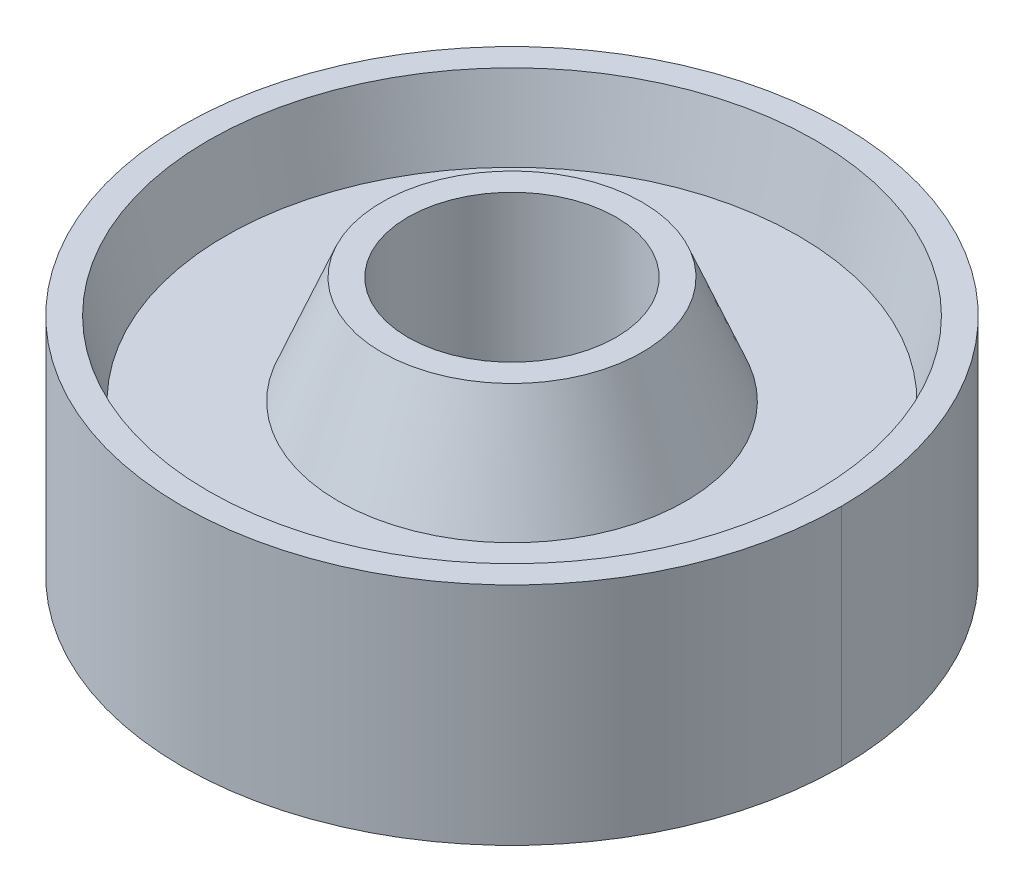
ISO-10303-21;
HEADER;
FILE_DESCRIPTION(('STEP AP214'),'2;1');
FILE_NAME('part.step','',(''),(''),'','','');
FILE_SCHEMA(('AUTOMOTIVE_DESIGN { 1 0 10303 214 1 1 1 1 }'));
ENDSEC;
DATA;
#1=APPLICATION_CONTEXT('core data for automotive mechanical design processes');
#2=APPLICATION_PROTOCOL_DEFINITION('international standard','automotive_design',2000,#1);
#3=PRODUCT_CONTEXT('',#1,'mechanical');
#4=PRODUCT('Part','Part','',(#3));
#5=PRODUCT_RELATED_PRODUCT_CATEGORY('part','',(#4));
#6=PRODUCT_DEFINITION_FORMATION('','',#4);
#7=PRODUCT_DEFINITION_CONTEXT('part definition',#1,'design');
#8=PRODUCT_DEFINITION('design','',#6,#7);
#9=PRODUCT_DEFINITION_SHAPE('','',#8);
#10=(LENGTH_UNIT() NAMED_UNIT(*) SI_UNIT(.MILLI.,.METRE.));
#11=(NAMED_UNIT(*) PLANE_ANGLE_UNIT() SI_UNIT($,.RADIAN.));
#12=(NAMED_UNIT(*) SI_UNIT($,.STERADIAN.) SOLID_ANGLE_UNIT());
#13=UNCERTAINTY_MEASURE_WITH_UNIT(LENGTH_MEASURE(1.E-05),#10,'distance_accuracy_value','');
#14=(GEOMETRIC_REPRESENTATION_CONTEXT(3) GLOBAL_UNCERTAINTY_ASSIGNED_CONTEXT((#13)) GLOBAL_UNIT_ASSIGNED_CONTEXT((#10,
#11,#12)) REPRESENTATION_CONTEXT('',''));
#15=CARTESIAN_POINT('',(0.,0.,0.));
#16=DIRECTION('',(0.,0.,1.));
#17=DIRECTION('',(1.,0.,0.));
#18=AXIS2_PLACEMENT_3D('',#15,#16,#17);
#19=CARTESIAN_POINT('',(7.73091778383936,46.3143317230274,0.));
#20=DIRECTION('',(0.,1.,0.));
#21=DIRECTION('',(0.,0.,1.));
#22=AXIS2_PLACEMENT_3D('',#19,#20,#21);
#23=CYLINDRICAL_SURFACE('',#22,38.);
#24=CARTESIAN_POINT('',(7.73091778383936,16.4714975845411,0.));
#25=DIRECTION('',(0.,1.,0.));
#26=DIRECTION('',(0.,0.,1.));
#27=AXIS2_PLACEMENT_3D('',#24,#25,#26);
#28=CIRCLE('',#27,38.);
#29=CARTESIAN_POINT('',(45.7309177838394,16.4714975845411,0.));
#30=VERTEX_POINT('',#29);
#31=CARTESIAN_POINT('',(-30.2690822161606,16.4714975845411,0.));
#32=VERTEX_POINT('',#31);
#33=EDGE_CURVE('E79',#30,#32,#28,.T.);
#34=ORIENTED_EDGE('',*,*,#33,.T.);
#35=DIRECTION('',(0.,1.,0.));
#36=VECTOR('',#35,1.);
#37=CARTESIAN_POINT('',(-30.2690822161606,46.3143317230274,0.));
#38=LINE('',#37,#36);
#39=CARTESIAN_POINT('',(-30.2690822161606,42.471497584541,0.));
#40=VERTEX_POINT('',#39);
#41=EDGE_CURVE('E11',#32,#40,#38,.T.);
#42=ORIENTED_EDGE('',*,*,#41,.T.);
#43=CARTESIAN_POINT('',(7.73091778383936,42.471497584541,0.));
#44=DIRECTION('',(0.,1.,0.));
#45=DIRECTION('',(0.,0.,1.));
#46=AXIS2_PLACEMENT_3D('',#43,#44,#45);
#47=CIRCLE('',#46,38.);
#48=CARTESIAN_POINT('',(45.7309177838394,42.471497584541,0.));
#49=VERTEX_POINT('',#48);
#50=EDGE_CURVE('E77',#49,#40,#47,.T.);
#51=ORIENTED_EDGE('',*,*,#50,.F.);
#52=DIRECTION('',(0.,-1.,0.));
#53=VECTOR('',#52,1.);
#54=CARTESIAN_POINT('',(45.7309177838394,46.3143317230274,0.));
#55=LINE('',#54,#53);
#56=EDGE_CURVE('E57',#49,#30,#55,.T.);
#57=ORIENTED_EDGE('',*,*,#56,.T.);
#58=EDGE_LOOP('',(#34,#42,#51,#57));
#59=FACE_BOUND('',#58,.T.);
#60=ADVANCED_FACE('F48',(#59),#23,.T.);
#61=CARTESIAN_POINT('',(7.73091778383936,12.6286634460547,0.));
#62=DIRECTION('',(0.,1.,0.));
#63=DIRECTION('',(0.,0.,1.));
#64=AXIS2_PLACEMENT_3D('',#61,#62,#63);
#65=CONICAL_SURFACE('',#64,15.,0.384388415707495);
#66=CARTESIAN_POINT('',(7.73091778383936,24.9892914653784,0.));
#67=DIRECTION('',(0.,1.,0.));
#68=DIRECTION('',(0.,0.,1.));
#69=AXIS2_PLACEMENT_3D('',#66,#67,#68);
#70=CIRCLE('',#69,20.);
#71=CARTESIAN_POINT('',(7.73091778383936,24.9892914653784,20.));
#72=VERTEX_POINT('',#71);
#73=EDGE_CURVE('E279',#72,#72,#70,.T.);
#74=ORIENTED_EDGE('',*,*,#73,.F.);
#75=EDGE_LOOP('',(#74));
#76=FACE_BOUND('',#75,.T.);
#77=CARTESIAN_POINT('',(7.73091778383936,12.6286634460547,0.));
#78=DIRECTION('',(0.,1.,0.));
#79=DIRECTION('',(0.,0.,1.));
#80=AXIS2_PLACEMENT_3D('',#77,#78,#79);
#81=CIRCLE('',#80,15.);
#82=CARTESIAN_POINT('',(7.73091778383936,12.6286634460547,15.));
#83=VERTEX_POINT('',#82);
#84=EDGE_CURVE('E86',#83,#83,#81,.T.);
#85=ORIENTED_EDGE('',*,*,#84,.T.);
#86=EDGE_LOOP('',(#85));
#87=FACE_BOUND('',#86,.T.);
#88=ADVANCED_FACE('F50',(#76,#87),#65,.T.);
#89=CARTESIAN_POINT('',(7.73091778383939,12.6286634460547,0.));
#90=DIRECTION('',(0.,1.,0.));
#91=DIRECTION('',(0.,0.,1.));
#92=AXIS2_PLACEMENT_3D('',#89,#90,#91);
#93=PLANE('',#92);
#94=CARTESIAN_POINT('',(7.73091778383936,12.6286634460547,0.));
#95=DIRECTION('',(0.,1.,0.));
#96=DIRECTION('',(0.,0.,1.));
#97=AXIS2_PLACEMENT_3D('',#94,#95,#96);
#98=CIRCLE('',#97,12.);
#99=CARTESIAN_POINT('',(7.73091778383936,12.6286634460547,12.));
#100=VERTEX_POINT('',#99);
#101=EDGE_CURVE('E274',#100,#100,#98,.F.);
#102=ORIENTED_EDGE('',*,*,#101,.F.);
#103=EDGE_LOOP('',(#102));
#104=FACE_BOUND('',#103,.T.);
#105=ORIENTED_EDGE('',*,*,#84,.F.);
#106=EDGE_LOOP('',(#105));
#107=FACE_BOUND('',#106,.T.);
#108=ADVANCED_FACE('F112',(#104,#107),#93,.F.);
#109=CARTESIAN_POINT('',(7.73091778383936,46.3143317230274,0.));
#110=DIRECTION('',(0.,-1.,0.));
#111=DIRECTION('',(0.,0.,-1.));
#112=AXIS2_PLACEMENT_3D('',#109,#110,#111);
#113=PLANE('',#112);
#114=CARTESIAN_POINT('',(7.73091778383936,46.3143317230274,0.));
#115=DIRECTION('',(0.,1.,0.));
#116=DIRECTION('',(0.,0.,1.));
#117=AXIS2_PLACEMENT_3D('',#114,#115,#116);
#118=CIRCLE('',#117,12.);
#119=CARTESIAN_POINT('',(7.73091778383936,46.3143317230274,12.));
#120=VERTEX_POINT('',#119);
#121=EDGE_CURVE('E277',#120,#120,#118,.T.);
#122=ORIENTED_EDGE('',*,*,#121,.F.);
#123=EDGE_LOOP('',(#122));
#124=FACE_BOUND('',#123,.T.);
#125=CARTESIAN_POINT('',(7.73091778383936,46.3143317230274,0.));
#126=DIRECTION('',(0.,1.,0.));
#127=DIRECTION('',(0.,0.,1.));
#128=AXIS2_PLACEMENT_3D('',#125,#126,#127);
#129=CIRCLE('',#128,15.);
#130=CARTESIAN_POINT('',(7.73091778383936,46.3143317230274,15.));
#131=VERTEX_POINT('',#130);
#132=EDGE_CURVE('E103',#131,#131,#129,.T.);
#133=ORIENTED_EDGE('',*,*,#132,.T.);
#134=EDGE_LOOP('',(#133));
#135=FACE_BOUND('',#134,.T.);
#136=ADVANCED_FACE('F114',(#124,#135),#113,.F.);
#137=CARTESIAN_POINT('',(7.73091778383936,33.9537037037037,0.));
#138=DIRECTION('',(0.,-1.,0.));
#139=DIRECTION('',(0.,0.,-1.));
#140=AXIS2_PLACEMENT_3D('',#137,#138,#139);
#141=CONICAL_SURFACE('',#140,20.,0.384388415707495);
#142=ORIENTED_EDGE('',*,*,#132,.F.);
#143=EDGE_LOOP('',(#142));
#144=FACE_BOUND('',#143,.T.);
#145=CARTESIAN_POINT('',(7.73091778383936,33.9537037037037,0.));
#146=DIRECTION('',(0.,1.,0.));
#147=DIRECTION('',(0.,0.,1.));
#148=AXIS2_PLACEMENT_3D('',#145,#146,#147);
#149=CIRCLE('',#148,20.);
#150=CARTESIAN_POINT('',(7.73091778383936,33.9537037037037,20.));
#151=VERTEX_POINT('',#150);
#152=EDGE_CURVE('E99',#151,#151,#149,.T.);
#153=ORIENTED_EDGE('',*,*,#152,.T.);
#154=EDGE_LOOP('',(#153));
#155=FACE_BOUND('',#154,.T.);
#156=ADVANCED_FACE('F120',(#144,#155),#141,.T.);
#157=CARTESIAN_POINT('',(27.7309177838394,33.9537037037037,0.));
#158=DIRECTION('',(0.,-1.,0.));
#159=DIRECTION('',(0.,0.,-1.));
#160=AXIS2_PLACEMENT_3D('',#157,#158,#159);
#161=PLANE('',#160);
#162=ORIENTED_EDGE('',*,*,#152,.F.);
#163=EDGE_LOOP('',(#162));
#164=FACE_BOUND('',#163,.T.);
#165=CARTESIAN_POINT('',(7.73091778383936,33.9537037037037,0.));
#166=DIRECTION('',(0.,1.,0.));
#167=DIRECTION('',(0.,0.,1.));
#168=AXIS2_PLACEMENT_3D('',#165,#166,#167);
#169=CIRCLE('',#168,33.);
#170=CARTESIAN_POINT('',(7.73091778383936,33.9537037037037,33.));
#171=VERTEX_POINT('',#170);
#172=EDGE_CURVE('E91',#171,#171,#169,.T.);
#173=ORIENTED_EDGE('',*,*,#172,.T.);
#174=EDGE_LOOP('',(#173));
#175=FACE_BOUND('',#174,.T.);
#176=ADVANCED_FACE('F144',(#164,#175),#161,.F.);
#177=CARTESIAN_POINT('',(7.73091778383936,42.471497584541,0.));
#178=DIRECTION('',(0.,1.,0.));
#179=DIRECTION('',(0.,0.,1.));
#180=AXIS2_PLACEMENT_3D('',#177,#178,#179);
#181=CONICAL_SURFACE('',#180,35.,0.230624866439515);
#182=ORIENTED_EDGE('',*,*,#172,.F.);
#183=EDGE_LOOP('',(#182));
#184=FACE_BOUND('',#183,.T.);
#185=CARTESIAN_POINT('',(7.73091778383936,42.471497584541,0.));
#186=DIRECTION('',(0.,1.,0.));
#187=DIRECTION('',(0.,0.,1.));
#188=AXIS2_PLACEMENT_3D('',#185,#186,#187);
#189=CIRCLE('',#188,35.);
#190=CARTESIAN_POINT('',(7.73091778383936,42.471497584541,35.));
#191=VERTEX_POINT('',#190);
#192=EDGE_CURVE('E88',#191,#191,#189,.T.);
#193=ORIENTED_EDGE('',*,*,#192,.T.);
#194=EDGE_LOOP('',(#193));
#195=FACE_BOUND('',#194,.T.);
#196=ADVANCED_FACE('F139',(#184,#195),#181,.F.);
#197=CARTESIAN_POINT('',(42.7309177838394,42.471497584541,0.));
#198=DIRECTION('',(0.,-1.,0.));
#199=DIRECTION('',(0.,0.,-1.));
#200=AXIS2_PLACEMENT_3D('',#197,#198,#199);
#201=PLANE('',#200);
#202=ORIENTED_EDGE('',*,*,#192,.F.);
#203=EDGE_LOOP('',(#202));
#204=FACE_BOUND('',#203,.T.);
#205=ORIENTED_EDGE('',*,*,#50,.T.);
#206=EDGE_CURVE('E74',#40,#49,#47,.T.);
#207=ORIENTED_EDGE('',*,*,#206,.T.);
#208=EDGE_LOOP('',(#205,#207));
#209=FACE_BOUND('',#208,.T.);
#210=ADVANCED_FACE('F76',(#204,#209),#201,.F.);
#211=ORIENTED_EDGE('',*,*,#41,.F.);
#212=EDGE_CURVE('E83',#32,#30,#28,.T.);
#213=ORIENTED_EDGE('',*,*,#212,.T.);
#214=ORIENTED_EDGE('',*,*,#56,.F.);
#215=ORIENTED_EDGE('',*,*,#206,.F.);
#216=EDGE_LOOP('',(#211,#213,#214,#215));
#217=FACE_BOUND('',#216,.T.);
#218=ADVANCED_FACE('F82',(#217),#23,.T.);
#219=CARTESIAN_POINT('',(42.7309177838394,16.4714975845411,0.));
#220=DIRECTION('',(0.,1.,0.));
#221=DIRECTION('',(0.,0.,1.));
#222=AXIS2_PLACEMENT_3D('',#219,#220,#221);
#223=PLANE('',#222);
#224=ORIENTED_EDGE('',*,*,#33,.F.);
#225=ORIENTED_EDGE('',*,*,#212,.F.);
#226=EDGE_LOOP('',(#224,#225));
#227=FACE_BOUND('',#226,.T.);
#228=CARTESIAN_POINT('',(7.73091778383936,16.4714975845411,0.));
#229=DIRECTION('',(0.,1.,0.));
#230=DIRECTION('',(0.,0.,1.));
#231=AXIS2_PLACEMENT_3D('',#228,#229,#230);
#232=CIRCLE('',#231,35.);
#233=CARTESIAN_POINT('',(7.73091778383936,16.4714975845411,35.));
#234=VERTEX_POINT('',#233);
#235=EDGE_CURVE('E290',#234,#234,#232,.T.);
#236=ORIENTED_EDGE('',*,*,#235,.T.);
#237=EDGE_LOOP('',(#236));
#238=FACE_BOUND('',#237,.T.);
#239=ADVANCED_FACE('F134',(#227,#238),#223,.F.);
#240=CARTESIAN_POINT('',(7.73091778383936,24.9892914653784,0.));
#241=DIRECTION('',(0.,-1.,0.));
#242=DIRECTION('',(0.,0.,-1.));
#243=AXIS2_PLACEMENT_3D('',#240,#241,#242);
#244=CONICAL_SURFACE('',#243,33.,0.230624866439515);
#245=ORIENTED_EDGE('',*,*,#235,.F.);
#246=EDGE_LOOP('',(#245));
#247=FACE_BOUND('',#246,.T.);
#248=CARTESIAN_POINT('',(7.73091778383936,24.9892914653784,0.));
#249=DIRECTION('',(0.,1.,0.));
#250=DIRECTION('',(0.,0.,1.));
#251=AXIS2_PLACEMENT_3D('',#248,#249,#250);
#252=CIRCLE('',#251,33.);
#253=CARTESIAN_POINT('',(7.73091778383936,24.9892914653784,33.));
#254=VERTEX_POINT('',#253);
#255=EDGE_CURVE('E284',#254,#254,#252,.T.);
#256=ORIENTED_EDGE('',*,*,#255,.T.);
#257=EDGE_LOOP('',(#256));
#258=FACE_BOUND('',#257,.T.);
#259=ADVANCED_FACE('F137',(#247,#258),#244,.F.);
#260=CARTESIAN_POINT('',(27.7309177838394,24.9892914653784,0.));
#261=DIRECTION('',(0.,1.,0.));
#262=DIRECTION('',(0.,0.,1.));
#263=AXIS2_PLACEMENT_3D('',#260,#261,#262);
#264=PLANE('',#263);
#265=ORIENTED_EDGE('',*,*,#255,.F.);
#266=EDGE_LOOP('',(#265));
#267=FACE_BOUND('',#266,.T.);
#268=ORIENTED_EDGE('',*,*,#73,.T.);
#269=EDGE_LOOP('',(#268));
#270=FACE_BOUND('',#269,.T.);
#271=ADVANCED_FACE('F201',(#267,#270),#264,.F.);
#272=CARTESIAN_POINT('',(7.73091778383936,12.6266634460547,0.));
#273=DIRECTION('',(0.,1.,0.));
#274=DIRECTION('',(0.,0.,1.));
#275=AXIS2_PLACEMENT_3D('',#272,#273,#274);
#276=CYLINDRICAL_SURFACE('',#275,12.);
#277=ORIENTED_EDGE('',*,*,#101,.T.);
#278=EDGE_LOOP('',(#277));
#279=FACE_BOUND('',#278,.T.);
#280=ORIENTED_EDGE('',*,*,#121,.T.);
#281=EDGE_LOOP('',(#280));
#282=FACE_BOUND('',#281,.T.);
#283=ADVANCED_FACE('F208',(#279,#282),#276,.F.);
#284=CLOSED_SHELL('',(#60,#88,#108,#136,#156,#176,#196,#210,#218,#239,#259,#271,#283));
#285=MANIFOLD_SOLID_BREP('B2',#284);
#286=ADVANCED_BREP_SHAPE_REPRESENTATION('',(#18,#285),#14);
#287=SHAPE_DEFINITION_REPRESENTATION(#9,#286);
ENDSEC;
END-ISO-10303-21;
